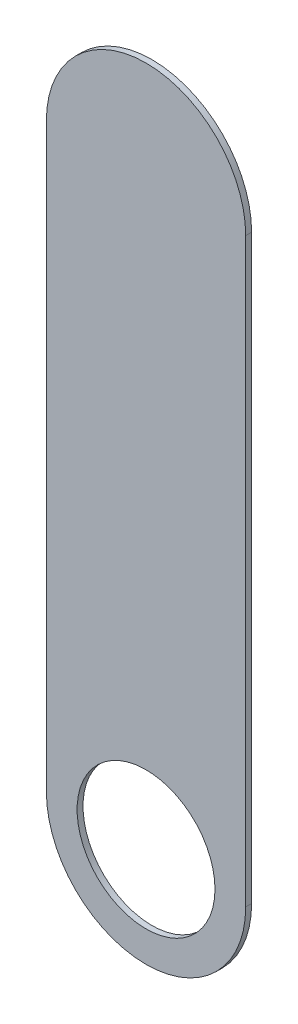
ISO-10303-21;
HEADER;
FILE_DESCRIPTION(('STEP AP214'),'2;1');
FILE_NAME('part.step','',(''),(''),'','','');
FILE_SCHEMA(('AUTOMOTIVE_DESIGN { 1 0 10303 214 1 1 1 1 }'));
ENDSEC;
DATA;
#1=APPLICATION_CONTEXT('core data for automotive mechanical design processes');
#2=APPLICATION_PROTOCOL_DEFINITION('international standard','automotive_design',2000,#1);
#3=PRODUCT_CONTEXT('',#1,'mechanical');
#4=PRODUCT('Part','Part','',(#3));
#5=PRODUCT_RELATED_PRODUCT_CATEGORY('part','',(#4));
#6=PRODUCT_DEFINITION_FORMATION('','',#4);
#7=PRODUCT_DEFINITION_CONTEXT('part definition',#1,'design');
#8=PRODUCT_DEFINITION('design','',#6,#7);
#9=PRODUCT_DEFINITION_SHAPE('','',#8);
#10=(LENGTH_UNIT() NAMED_UNIT(*) SI_UNIT(.MILLI.,.METRE.));
#11=(NAMED_UNIT(*) PLANE_ANGLE_UNIT() SI_UNIT($,.RADIAN.));
#12=(NAMED_UNIT(*) SI_UNIT($,.STERADIAN.) SOLID_ANGLE_UNIT());
#13=UNCERTAINTY_MEASURE_WITH_UNIT(LENGTH_MEASURE(1.E-05),#10,'distance_accuracy_value','');
#14=(GEOMETRIC_REPRESENTATION_CONTEXT(3) GLOBAL_UNCERTAINTY_ASSIGNED_CONTEXT((#13)) GLOBAL_UNIT_ASSIGNED_CONTEXT((#10,
#11,#12)) REPRESENTATION_CONTEXT('',''));
#15=CARTESIAN_POINT('',(0.,0.,0.));
#16=DIRECTION('',(0.,0.,1.));
#17=DIRECTION('',(1.,0.,0.));
#18=AXIS2_PLACEMENT_3D('',#15,#16,#17);
#19=CARTESIAN_POINT('',(38.4999992,113.5000016,0.));
#20=DIRECTION('',(-1.,0.,0.));
#21=DIRECTION('',(0.,1.,0.));
#22=AXIS2_PLACEMENT_3D('',#19,#20,#21);
#23=PLANE('',#22);
#24=DIRECTION('',(0.,1.,0.));
#25=VECTOR('',#24,1.);
#26=CARTESIAN_POINT('',(38.4999992,113.5000016,0.03556));
#27=LINE('',#26,#25);
#28=CARTESIAN_POINT('',(38.4999992,113.5000016,0.03556));
#29=VERTEX_POINT('',#28);
#30=CARTESIAN_POINT('',(38.4999992,117.00002,0.03556));
#31=VERTEX_POINT('',#30);
#32=EDGE_CURVE('E11',#29,#31,#27,.T.);
#33=ORIENTED_EDGE('',*,*,#32,.F.);
#34=DIRECTION('',(0.,0.,1.));
#35=VECTOR('',#34,1.);
#36=CARTESIAN_POINT('',(38.4999992,113.5000016,0.));
#37=LINE('',#36,#35);
#38=CARTESIAN_POINT('',(38.4999992,113.5000016,0.));
#39=VERTEX_POINT('',#38);
#40=EDGE_CURVE('E24',#39,#29,#37,.T.);
#41=ORIENTED_EDGE('',*,*,#40,.F.);
#42=DIRECTION('',(0.,1.,0.));
#43=VECTOR('',#42,1.);
#44=CARTESIAN_POINT('',(38.4999992,113.5000016,0.));
#45=LINE('',#44,#43);
#46=CARTESIAN_POINT('',(38.4999992,117.00002,0.));
#47=VERTEX_POINT('',#46);
#48=EDGE_CURVE('E96',#39,#47,#45,.T.);
#49=ORIENTED_EDGE('',*,*,#48,.T.);
#50=DIRECTION('',(0.,0.,1.));
#51=VECTOR('',#50,1.);
#52=CARTESIAN_POINT('',(38.4999992,117.00002,0.));
#53=LINE('',#52,#51);
#54=EDGE_CURVE('E37',#47,#31,#53,.T.);
#55=ORIENTED_EDGE('',*,*,#54,.T.);
#56=EDGE_LOOP('',(#33,#41,#49,#55));
#57=FACE_BOUND('',#56,.T.);
#58=ADVANCED_FACE('F17',(#57),#23,.F.);
#59=CARTESIAN_POINT('',(37.9000004,113.5000016,0.));
#60=DIRECTION('',(0.,0.,-1.));
#61=DIRECTION('',(-1.,0.,0.));
#62=AXIS2_PLACEMENT_3D('',#59,#60,#61);
#63=CYLINDRICAL_SURFACE('',#62,0.599998799999997);
#64=CARTESIAN_POINT('',(37.9000004,113.5000016,0.03556));
#65=DIRECTION('',(0.,0.,1.));
#66=DIRECTION('',(-1.,0.,0.));
#67=AXIS2_PLACEMENT_3D('',#64,#65,#66);
#68=CIRCLE('',#67,0.599998799999997);
#69=CARTESIAN_POINT('',(37.3000016,113.5000016,0.03556));
#70=VERTEX_POINT('',#69);
#71=EDGE_CURVE('E92',#70,#29,#68,.T.);
#72=ORIENTED_EDGE('',*,*,#71,.F.);
#73=DIRECTION('',(0.,0.,1.));
#74=VECTOR('',#73,1.);
#75=CARTESIAN_POINT('',(37.3000016,113.5000016,0.));
#76=LINE('',#75,#74);
#77=CARTESIAN_POINT('',(37.3000016,113.5000016,0.));
#78=VERTEX_POINT('',#77);
#79=EDGE_CURVE('E90',#78,#70,#76,.T.);
#80=ORIENTED_EDGE('',*,*,#79,.F.);
#81=CARTESIAN_POINT('',(37.9000004,113.5000016,0.));
#82=DIRECTION('',(0.,0.,1.));
#83=DIRECTION('',(-1.,0.,0.));
#84=AXIS2_PLACEMENT_3D('',#81,#82,#83);
#85=CIRCLE('',#84,0.599998799999997);
#86=EDGE_CURVE('E88',#78,#39,#85,.T.);
#87=ORIENTED_EDGE('',*,*,#86,.T.);
#88=ORIENTED_EDGE('',*,*,#40,.T.);
#89=EDGE_LOOP('',(#72,#80,#87,#88));
#90=FACE_BOUND('',#89,.T.);
#91=ADVANCED_FACE('F111',(#90),#63,.T.);
#92=CARTESIAN_POINT('',(37.9000004,117.00002,0.));
#93=DIRECTION('',(0.,0.,-1.));
#94=DIRECTION('',(1.,0.,0.));
#95=AXIS2_PLACEMENT_3D('',#92,#93,#94);
#96=CYLINDRICAL_SURFACE('',#95,0.599998799999997);
#97=CARTESIAN_POINT('',(37.9000004,117.00002,0.03556));
#98=DIRECTION('',(0.,0.,1.));
#99=DIRECTION('',(1.,0.,0.));
#100=AXIS2_PLACEMENT_3D('',#97,#98,#99);
#101=CIRCLE('',#100,0.599998799999997);
#102=CARTESIAN_POINT('',(37.3000016,117.00002,0.03556));
#103=VERTEX_POINT('',#102);
#104=EDGE_CURVE('E85',#31,#103,#101,.T.);
#105=ORIENTED_EDGE('',*,*,#104,.F.);
#106=ORIENTED_EDGE('',*,*,#54,.F.);
#107=CARTESIAN_POINT('',(37.9000004,117.00002,0.));
#108=DIRECTION('',(0.,0.,1.));
#109=DIRECTION('',(1.,0.,0.));
#110=AXIS2_PLACEMENT_3D('',#107,#108,#109);
#111=CIRCLE('',#110,0.599998799999997);
#112=CARTESIAN_POINT('',(37.3000016,117.00002,0.));
#113=VERTEX_POINT('',#112);
#114=EDGE_CURVE('E82',#47,#113,#111,.T.);
#115=ORIENTED_EDGE('',*,*,#114,.T.);
#116=DIRECTION('',(0.,0.,1.));
#117=VECTOR('',#116,1.);
#118=CARTESIAN_POINT('',(37.3000016,117.00002,0.));
#119=LINE('',#118,#117);
#120=EDGE_CURVE('E80',#113,#103,#119,.T.);
#121=ORIENTED_EDGE('',*,*,#120,.T.);
#122=EDGE_LOOP('',(#105,#106,#115,#121));
#123=FACE_BOUND('',#122,.T.);
#124=ADVANCED_FACE('F104',(#123),#96,.T.);
#125=CARTESIAN_POINT('',(37.3000016,117.00002,0.));
#126=DIRECTION('',(1.,0.,0.));
#127=DIRECTION('',(0.,-1.,0.));
#128=AXIS2_PLACEMENT_3D('',#125,#126,#127);
#129=PLANE('',#128);
#130=DIRECTION('',(0.,-1.,0.));
#131=VECTOR('',#130,1.);
#132=CARTESIAN_POINT('',(37.3000016,117.00002,0.03556));
#133=LINE('',#132,#131);
#134=EDGE_CURVE('E77',#103,#70,#133,.T.);
#135=ORIENTED_EDGE('',*,*,#134,.F.);
#136=ORIENTED_EDGE('',*,*,#120,.F.);
#137=DIRECTION('',(0.,-1.,0.));
#138=VECTOR('',#137,1.);
#139=CARTESIAN_POINT('',(37.3000016,117.00002,0.));
#140=LINE('',#139,#138);
#141=EDGE_CURVE('E68',#113,#78,#140,.T.);
#142=ORIENTED_EDGE('',*,*,#141,.T.);
#143=ORIENTED_EDGE('',*,*,#79,.T.);
#144=EDGE_LOOP('',(#135,#136,#142,#143));
#145=FACE_BOUND('',#144,.T.);
#146=ADVANCED_FACE('F110',(#145),#129,.F.);
#147=CARTESIAN_POINT('',(37.9000004,113.5000016,0.));
#148=DIRECTION('',(0.,0.,-1.));
#149=DIRECTION('',(1.,0.,0.));
#150=AXIS2_PLACEMENT_3D('',#147,#148,#149);
#151=CYLINDRICAL_SURFACE('',#150,0.41500044);
#152=DIRECTION('',(0.,0.,1.));
#153=VECTOR('',#152,1.);
#154=CARTESIAN_POINT('',(38.31500084,113.5000016,0.));
#155=LINE('',#154,#153);
#156=CARTESIAN_POINT('',(38.31500084,113.5000016,0.));
#157=VERTEX_POINT('',#156);
#158=CARTESIAN_POINT('',(38.31500084,113.5000016,0.03556));
#159=VERTEX_POINT('',#158);
#160=EDGE_CURVE('E62',#157,#159,#155,.T.);
#161=ORIENTED_EDGE('',*,*,#160,.T.);
#162=CARTESIAN_POINT('',(37.9000004,113.5000016,0.03556));
#163=DIRECTION('',(0.,0.,1.));
#164=DIRECTION('',(1.,0.,0.));
#165=AXIS2_PLACEMENT_3D('',#162,#163,#164);
#166=CIRCLE('',#165,0.41500044);
#167=EDGE_CURVE('E67',#159,#159,#166,.T.);
#168=ORIENTED_EDGE('',*,*,#167,.T.);
#169=ORIENTED_EDGE('',*,*,#160,.F.);
#170=CARTESIAN_POINT('',(37.9000004,113.5000016,0.));
#171=DIRECTION('',(0.,0.,1.));
#172=DIRECTION('',(1.,0.,0.));
#173=AXIS2_PLACEMENT_3D('',#170,#171,#172);
#174=CIRCLE('',#173,0.41500044);
#175=EDGE_CURVE('E65',#157,#157,#174,.T.);
#176=ORIENTED_EDGE('',*,*,#175,.F.);
#177=EDGE_LOOP('',(#161,#168,#169,#176));
#178=FACE_BOUND('',#177,.T.);
#179=ADVANCED_FACE('F64',(#178),#151,.F.);
#180=CARTESIAN_POINT('',(38.4999992,113.5000016,0.));
#181=DIRECTION('',(0.,0.,-1.));
#182=DIRECTION('',(-1.,0.,0.));
#183=AXIS2_PLACEMENT_3D('',#180,#181,#182);
#184=PLANE('',#183);
#185=ORIENTED_EDGE('',*,*,#48,.F.);
#186=ORIENTED_EDGE('',*,*,#86,.F.);
#187=ORIENTED_EDGE('',*,*,#141,.F.);
#188=ORIENTED_EDGE('',*,*,#114,.F.);
#189=EDGE_LOOP('',(#185,#186,#187,#188));
#190=FACE_BOUND('',#189,.T.);
#191=ORIENTED_EDGE('',*,*,#175,.T.);
#192=EDGE_LOOP('',(#191));
#193=FACE_BOUND('',#192,.T.);
#194=ADVANCED_FACE('F71',(#190,#193),#184,.T.);
#195=CARTESIAN_POINT('',(38.4999992,113.5000016,0.03556));
#196=DIRECTION('',(0.,0.,-1.));
#197=DIRECTION('',(-1.,0.,0.));
#198=AXIS2_PLACEMENT_3D('',#195,#196,#197);
#199=PLANE('',#198);
#200=ORIENTED_EDGE('',*,*,#134,.T.);
#201=ORIENTED_EDGE('',*,*,#71,.T.);
#202=ORIENTED_EDGE('',*,*,#32,.T.);
#203=ORIENTED_EDGE('',*,*,#104,.T.);
#204=EDGE_LOOP('',(#200,#201,#202,#203));
#205=FACE_BOUND('',#204,.T.);
#206=ORIENTED_EDGE('',*,*,#167,.F.);
#207=EDGE_LOOP('',(#206));
#208=FACE_BOUND('',#207,.T.);
#209=ADVANCED_FACE('F107',(#205,#208),#199,.F.);
#210=CLOSED_SHELL('',(#58,#91,#124,#146,#179,#194,#209));
#211=MANIFOLD_SOLID_BREP('B1',#210);
#212=ADVANCED_BREP_SHAPE_REPRESENTATION('',(#18,#211),#14);
#213=SHAPE_DEFINITION_REPRESENTATION(#9,#212);
ENDSEC;
END-ISO-10303-21;
